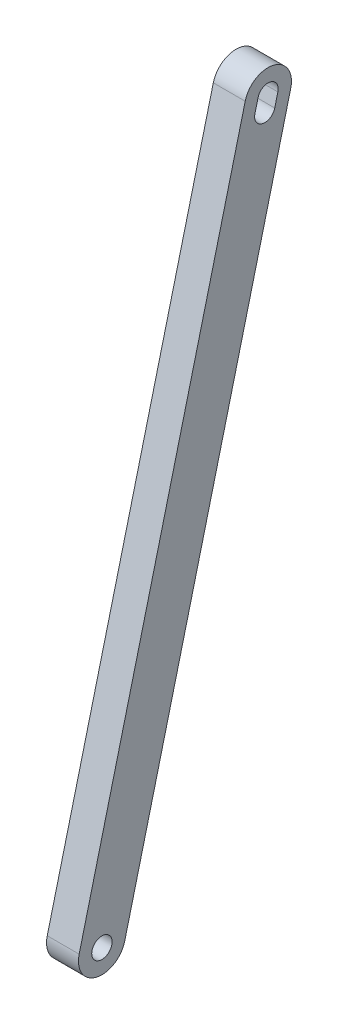
ISO-10303-21;
HEADER;
FILE_DESCRIPTION(('STEP AP214'),'2;1');
FILE_NAME('part.step','',(''),(''),'','','');
FILE_SCHEMA(('AUTOMOTIVE_DESIGN { 1 0 10303 214 1 1 1 1 }'));
ENDSEC;
DATA;
#1=APPLICATION_CONTEXT('core data for automotive mechanical design processes');
#2=APPLICATION_PROTOCOL_DEFINITION('international standard','automotive_design',2000,#1);
#3=PRODUCT_CONTEXT('',#1,'mechanical');
#4=PRODUCT('Part','Part','',(#3));
#5=PRODUCT_RELATED_PRODUCT_CATEGORY('part','',(#4));
#6=PRODUCT_DEFINITION_FORMATION('','',#4);
#7=PRODUCT_DEFINITION_CONTEXT('part definition',#1,'design');
#8=PRODUCT_DEFINITION('design','',#6,#7);
#9=PRODUCT_DEFINITION_SHAPE('','',#8);
#10=(LENGTH_UNIT() NAMED_UNIT(*) SI_UNIT(.MILLI.,.METRE.));
#11=(NAMED_UNIT(*) PLANE_ANGLE_UNIT() SI_UNIT($,.RADIAN.));
#12=(NAMED_UNIT(*) SI_UNIT($,.STERADIAN.) SOLID_ANGLE_UNIT());
#13=UNCERTAINTY_MEASURE_WITH_UNIT(LENGTH_MEASURE(1.E-05),#10,'distance_accuracy_value','');
#14=(GEOMETRIC_REPRESENTATION_CONTEXT(3) GLOBAL_UNCERTAINTY_ASSIGNED_CONTEXT((#13)) GLOBAL_UNIT_ASSIGNED_CONTEXT((#10,
#11,#12)) REPRESENTATION_CONTEXT('',''));
#15=CARTESIAN_POINT('',(0.,0.,0.));
#16=DIRECTION('',(0.,0.,1.));
#17=DIRECTION('',(1.,0.,0.));
#18=AXIS2_PLACEMENT_3D('',#15,#16,#17);
#19=CARTESIAN_POINT('',(-24.,0.,38.66));
#20=DIRECTION('',(1.,0.,0.));
#21=DIRECTION('',(0.,0.,-1.));
#22=AXIS2_PLACEMENT_3D('',#19,#20,#21);
#23=CYLINDRICAL_SURFACE('',#22,3.68146636835648);
#24=CARTESIAN_POINT('',(-19.,0.,38.66));
#25=DIRECTION('',(-1.,0.,0.));
#26=DIRECTION('',(0.,0.,1.));
#27=AXIS2_PLACEMENT_3D('',#24,#25,#26);
#28=CIRCLE('',#27,3.68146636835648);
#29=CARTESIAN_POINT('',(-19.,0.903807820001601,42.2287989640555));
#30=VERTEX_POINT('',#29);
#31=CARTESIAN_POINT('',(-19.,-0.903807820001601,35.0912010359445));
#32=VERTEX_POINT('',#31);
#33=EDGE_CURVE('E139',#30,#32,#28,.T.);
#34=ORIENTED_EDGE('',*,*,#33,.T.);
#35=DIRECTION('',(1.,0.,0.));
#36=VECTOR('',#35,1.);
#37=CARTESIAN_POINT('',(-24.,-0.903807820001601,35.0912010359445));
#38=LINE('',#37,#36);
#39=CARTESIAN_POINT('',(-24.,-0.903807820001601,35.0912010359445));
#40=VERTEX_POINT('',#39);
#41=EDGE_CURVE('E11',#40,#32,#38,.T.);
#42=ORIENTED_EDGE('',*,*,#41,.F.);
#43=CARTESIAN_POINT('',(-24.,0.,38.66));
#44=DIRECTION('',(-1.,0.,0.));
#45=DIRECTION('',(0.,0.,1.));
#46=AXIS2_PLACEMENT_3D('',#43,#44,#45);
#47=CIRCLE('',#46,3.68146636835648);
#48=CARTESIAN_POINT('',(-24.,0.903807820001601,42.2287989640555));
#49=VERTEX_POINT('',#48);
#50=EDGE_CURVE('E177',#49,#40,#47,.T.);
#51=ORIENTED_EDGE('',*,*,#50,.F.);
#52=DIRECTION('',(1.,0.,0.));
#53=VECTOR('',#52,1.);
#54=CARTESIAN_POINT('',(-24.,0.903807820001601,42.2287989640555));
#55=LINE('',#54,#53);
#56=EDGE_CURVE('E68',#49,#30,#55,.T.);
#57=ORIENTED_EDGE('',*,*,#56,.T.);
#58=EDGE_LOOP('',(#34,#42,#51,#57));
#59=FACE_BOUND('',#58,.T.);
#60=ADVANCED_FACE('F42',(#59),#23,.T.);
#61=CARTESIAN_POINT('',(-24.,8.29683886746099,32.7611128160827));
#62=DIRECTION('',(0.,0.245502125938228,0.969396052271625));
#63=DIRECTION('',(0.,-0.969396052271625,0.245502125938228));
#64=AXIS2_PLACEMENT_3D('',#61,#62,#63);
#65=PLANE('',#64);
#66=DIRECTION('',(0.,-0.969396052271625,0.245502125938228));
#67=VECTOR('',#66,1.);
#68=CARTESIAN_POINT('',(-19.,8.29683886746099,32.7611128160827));
#69=LINE('',#68,#67);
#70=CARTESIAN_POINT('',(-19.,-103.659789360794,61.1144263853967));
#71=VERTEX_POINT('',#70);
#72=EDGE_CURVE('E141',#32,#71,#69,.T.);
#73=ORIENTED_EDGE('',*,*,#72,.T.);
#74=DIRECTION('',(1.,0.,0.));
#75=VECTOR('',#74,1.);
#76=CARTESIAN_POINT('',(-24.,-103.659789360794,61.1144263853967));
#77=LINE('',#76,#75);
#78=CARTESIAN_POINT('',(-24.,-103.659789360794,61.1144263853967));
#79=VERTEX_POINT('',#78);
#80=EDGE_CURVE('E55',#79,#71,#77,.T.);
#81=ORIENTED_EDGE('',*,*,#80,.F.);
#82=DIRECTION('',(0.,-0.969396052271625,0.245502125938228));
#83=VECTOR('',#82,1.);
#84=CARTESIAN_POINT('',(-24.,8.29683886746099,32.7611128160827));
#85=LINE('',#84,#83);
#86=EDGE_CURVE('E94',#40,#79,#85,.T.);
#87=ORIENTED_EDGE('',*,*,#86,.F.);
#88=ORIENTED_EDGE('',*,*,#41,.T.);
#89=EDGE_LOOP('',(#73,#81,#87,#88));
#90=FACE_BOUND('',#89,.T.);
#91=ADVANCED_FACE('F216',(#90),#65,.F.);
#92=CARTESIAN_POINT('',(-24.,-102.755981540792,64.6832253494522));
#93=DIRECTION('',(1.,0.,0.));
#94=DIRECTION('',(0.,0.,-1.));
#95=AXIS2_PLACEMENT_3D('',#92,#93,#94);
#96=CYLINDRICAL_SURFACE('',#95,3.68146636835646);
#97=CARTESIAN_POINT('',(-19.,-102.755981540792,64.6832253494522));
#98=DIRECTION('',(-1.,0.,0.));
#99=DIRECTION('',(0.,0.,1.));
#100=AXIS2_PLACEMENT_3D('',#97,#98,#99);
#101=CIRCLE('',#100,3.68146636835646);
#102=CARTESIAN_POINT('',(-19.,-101.852173720791,68.2520243135077));
#103=VERTEX_POINT('',#102);
#104=EDGE_CURVE('E155',#71,#103,#101,.T.);
#105=ORIENTED_EDGE('',*,*,#104,.T.);
#106=DIRECTION('',(1.,0.,0.));
#107=VECTOR('',#106,1.);
#108=CARTESIAN_POINT('',(-24.,-101.852173720791,68.2520243135077));
#109=LINE('',#108,#107);
#110=CARTESIAN_POINT('',(-24.,-101.852173720791,68.2520243135077));
#111=VERTEX_POINT('',#110);
#112=EDGE_CURVE('E165',#111,#103,#109,.T.);
#113=ORIENTED_EDGE('',*,*,#112,.F.);
#114=CARTESIAN_POINT('',(-24.,-102.755981540792,64.6832253494522));
#115=DIRECTION('',(-1.,0.,0.));
#116=DIRECTION('',(0.,0.,1.));
#117=AXIS2_PLACEMENT_3D('',#114,#115,#116);
#118=CIRCLE('',#117,3.68146636835646);
#119=EDGE_CURVE('E166',#79,#111,#118,.T.);
#120=ORIENTED_EDGE('',*,*,#119,.F.);
#121=ORIENTED_EDGE('',*,*,#80,.T.);
#122=EDGE_LOOP('',(#105,#113,#120,#121));
#123=FACE_BOUND('',#122,.T.);
#124=ADVANCED_FACE('F170',(#123),#96,.T.);
#125=CARTESIAN_POINT('',(-24.,10.1044545074642,39.8987107441938));
#126=DIRECTION('',(0.,0.245502125938228,0.969396052271625));
#127=DIRECTION('',(0.,-0.969396052271625,0.245502125938228));
#128=AXIS2_PLACEMENT_3D('',#125,#126,#127);
#129=PLANE('',#128);
#130=DIRECTION('',(0.,-0.969396052271625,0.245502125938228));
#131=VECTOR('',#130,1.);
#132=CARTESIAN_POINT('',(-19.,10.1044545074642,39.8987107441938));
#133=LINE('',#132,#131);
#134=EDGE_CURVE('E154',#30,#103,#133,.T.);
#135=ORIENTED_EDGE('',*,*,#134,.F.);
#136=ORIENTED_EDGE('',*,*,#56,.F.);
#137=DIRECTION('',(0.,-0.969396052271625,0.245502125938228));
#138=VECTOR('',#137,1.);
#139=CARTESIAN_POINT('',(-24.,10.1044545074642,39.8987107441938));
#140=LINE('',#139,#138);
#141=EDGE_CURVE('E175',#49,#111,#140,.T.);
#142=ORIENTED_EDGE('',*,*,#141,.T.);
#143=ORIENTED_EDGE('',*,*,#112,.T.);
#144=EDGE_LOOP('',(#135,#136,#142,#143));
#145=FACE_BOUND('',#144,.T.);
#146=ADVANCED_FACE('F174',(#145),#129,.T.);
#147=CARTESIAN_POINT('',(-24.,0.,38.66));
#148=DIRECTION('',(1.,0.,0.));
#149=DIRECTION('',(0.,0.,-1.));
#150=AXIS2_PLACEMENT_3D('',#147,#148,#149);
#151=CYLINDRICAL_SURFACE('',#150,1.6);
#152=CARTESIAN_POINT('',(-19.,0.,38.66));
#153=DIRECTION('',(-1.,0.,0.));
#154=DIRECTION('',(0.,0.,1.));
#155=AXIS2_PLACEMENT_3D('',#152,#153,#154);
#156=CIRCLE('',#155,1.6);
#157=CARTESIAN_POINT('',(-19.,-0.392803401501166,37.1089663163654));
#158=VERTEX_POINT('',#157);
#159=CARTESIAN_POINT('',(-19.,0.392803401501166,40.2110336836346));
#160=VERTEX_POINT('',#159);
#161=EDGE_CURVE('E133',#158,#160,#156,.F.);
#162=ORIENTED_EDGE('',*,*,#161,.T.);
#163=DIRECTION('',(-1.,0.,0.));
#164=VECTOR('',#163,1.);
#165=CARTESIAN_POINT('',(-19.,0.392803401501166,40.2110336836346));
#166=LINE('',#165,#164);
#167=CARTESIAN_POINT('',(-24.,0.392803401501166,40.2110336836346));
#168=VERTEX_POINT('',#167);
#169=EDGE_CURVE('E143',#160,#168,#166,.T.);
#170=ORIENTED_EDGE('',*,*,#169,.T.);
#171=CARTESIAN_POINT('',(-24.,0.,38.66));
#172=DIRECTION('',(-1.,0.,0.));
#173=DIRECTION('',(0.,0.,1.));
#174=AXIS2_PLACEMENT_3D('',#171,#172,#173);
#175=CIRCLE('',#174,1.6);
#176=CARTESIAN_POINT('',(-24.,-0.392803401501166,37.1089663163654));
#177=VERTEX_POINT('',#176);
#178=EDGE_CURVE('E136',#177,#168,#175,.F.);
#179=ORIENTED_EDGE('',*,*,#178,.F.);
#180=DIRECTION('',(-1.,0.,0.));
#181=VECTOR('',#180,1.);
#182=CARTESIAN_POINT('',(-19.,-0.392803401501166,37.1089663163654));
#183=LINE('',#182,#181);
#184=EDGE_CURVE('E117',#158,#177,#183,.T.);
#185=ORIENTED_EDGE('',*,*,#184,.F.);
#186=EDGE_LOOP('',(#162,#170,#179,#185));
#187=FACE_BOUND('',#186,.T.);
#188=ADVANCED_FACE('F46',(#187),#151,.F.);
#189=CARTESIAN_POINT('',(-24.,-102.755981540792,64.6832253494522));
#190=DIRECTION('',(1.,0.,0.));
#191=DIRECTION('',(0.,0.,-1.));
#192=AXIS2_PLACEMENT_3D('',#189,#190,#191);
#193=CYLINDRICAL_SURFACE('',#192,1.60000000000001);
#194=CARTESIAN_POINT('',(-24.,-102.755981540792,64.6832253494522));
#195=DIRECTION('',(-1.,0.,0.));
#196=DIRECTION('',(0.,0.,1.));
#197=AXIS2_PLACEMENT_3D('',#194,#195,#196);
#198=CIRCLE('',#197,1.60000000000001);
#199=CARTESIAN_POINT('',(-24.,-102.755981540792,66.2832253494522));
#200=VERTEX_POINT('',#199);
#201=EDGE_CURVE('E146',#200,#200,#198,.T.);
#202=ORIENTED_EDGE('',*,*,#201,.T.);
#203=EDGE_LOOP('',(#202));
#204=FACE_BOUND('',#203,.T.);
#205=CARTESIAN_POINT('',(-19.,-102.755981540792,64.6832253494522));
#206=DIRECTION('',(-1.,0.,0.));
#207=DIRECTION('',(0.,0.,1.));
#208=AXIS2_PLACEMENT_3D('',#205,#206,#207);
#209=CIRCLE('',#208,1.60000000000001);
#210=CARTESIAN_POINT('',(-19.,-102.755981540792,66.2832253494522));
#211=VERTEX_POINT('',#210);
#212=EDGE_CURVE('E158',#211,#211,#209,.T.);
#213=ORIENTED_EDGE('',*,*,#212,.F.);
#214=EDGE_LOOP('',(#213));
#215=FACE_BOUND('',#214,.T.);
#216=ADVANCED_FACE('F200',(#204,#215),#193,.F.);
#217=CARTESIAN_POINT('',(-24.,0.,0.));
#218=DIRECTION('',(-1.,0.,0.));
#219=DIRECTION('',(0.,0.,1.));
#220=AXIS2_PLACEMENT_3D('',#217,#218,#219);
#221=PLANE('',#220);
#222=DIRECTION('',(0.,-0.969396052271623,0.245502125938234));
#223=VECTOR('',#222,1.);
#224=CARTESIAN_POINT('',(-24.,-0.392803401501166,37.1089663163654));
#225=LINE('',#224,#223);
#226=CARTESIAN_POINT('',(-24.,-2.33159550604441,37.5999705682419));
#227=VERTEX_POINT('',#226);
#228=EDGE_CURVE('E190',#177,#227,#225,.T.);
#229=ORIENTED_EDGE('',*,*,#228,.F.);
#230=ORIENTED_EDGE('',*,*,#178,.T.);
#231=DIRECTION('',(0.,0.969396052271626,-0.245502125938224));
#232=VECTOR('',#231,1.);
#233=CARTESIAN_POINT('',(-24.,0.392803401501166,40.2110336836346));
#234=LINE('',#233,#232);
#235=CARTESIAN_POINT('',(-24.,-1.54598870304208,40.702037935511));
#236=VERTEX_POINT('',#235);
#237=EDGE_CURVE('E126',#236,#168,#234,.T.);
#238=ORIENTED_EDGE('',*,*,#237,.F.);
#239=CARTESIAN_POINT('',(-24.,-1.93879210454324,39.1510042518765));
#240=DIRECTION('',(-1.,0.,0.));
#241=DIRECTION('',(0.,0.,1.));
#242=AXIS2_PLACEMENT_3D('',#239,#240,#241);
#243=CIRCLE('',#242,1.59999999999999);
#244=EDGE_CURVE('E183',#227,#236,#243,.T.);
#245=ORIENTED_EDGE('',*,*,#244,.F.);
#246=EDGE_LOOP('',(#229,#230,#238,#245));
#247=FACE_BOUND('',#246,.T.);
#248=ORIENTED_EDGE('',*,*,#50,.T.);
#249=ORIENTED_EDGE('',*,*,#86,.T.);
#250=ORIENTED_EDGE('',*,*,#119,.T.);
#251=ORIENTED_EDGE('',*,*,#141,.F.);
#252=EDGE_LOOP('',(#248,#249,#250,#251));
#253=FACE_BOUND('',#252,.T.);
#254=ORIENTED_EDGE('',*,*,#201,.F.);
#255=EDGE_LOOP('',(#254));
#256=FACE_BOUND('',#255,.T.);
#257=ADVANCED_FACE('F197',(#247,#253,#256),#221,.T.);
#258=CARTESIAN_POINT('',(-19.,0.,0.));
#259=DIRECTION('',(-1.,0.,0.));
#260=DIRECTION('',(0.,0.,1.));
#261=AXIS2_PLACEMENT_3D('',#258,#259,#260);
#262=PLANE('',#261);
#263=CARTESIAN_POINT('',(-19.,-1.93879210454324,39.1510042518765));
#264=DIRECTION('',(-1.,0.,0.));
#265=DIRECTION('',(0.,0.,1.));
#266=AXIS2_PLACEMENT_3D('',#263,#264,#265);
#267=CIRCLE('',#266,1.59999999999999);
#268=CARTESIAN_POINT('',(-19.,-2.33159550604441,37.5999705682419));
#269=VERTEX_POINT('',#268);
#270=CARTESIAN_POINT('',(-19.,-1.54598870304208,40.702037935511));
#271=VERTEX_POINT('',#270);
#272=EDGE_CURVE('E130',#269,#271,#267,.T.);
#273=ORIENTED_EDGE('',*,*,#272,.T.);
#274=DIRECTION('',(0.,0.969396052271626,-0.245502125938224));
#275=VECTOR('',#274,1.);
#276=CARTESIAN_POINT('',(-19.,0.392803401501166,40.2110336836346));
#277=LINE('',#276,#275);
#278=EDGE_CURVE('E56',#271,#160,#277,.T.);
#279=ORIENTED_EDGE('',*,*,#278,.T.);
#280=ORIENTED_EDGE('',*,*,#161,.F.);
#281=DIRECTION('',(0.,-0.969396052271623,0.245502125938234));
#282=VECTOR('',#281,1.);
#283=CARTESIAN_POINT('',(-19.,-0.392803401501166,37.1089663163654));
#284=LINE('',#283,#282);
#285=EDGE_CURVE('E119',#158,#269,#284,.T.);
#286=ORIENTED_EDGE('',*,*,#285,.T.);
#287=EDGE_LOOP('',(#273,#279,#280,#286));
#288=FACE_BOUND('',#287,.T.);
#289=ORIENTED_EDGE('',*,*,#33,.F.);
#290=ORIENTED_EDGE('',*,*,#134,.T.);
#291=ORIENTED_EDGE('',*,*,#104,.F.);
#292=ORIENTED_EDGE('',*,*,#72,.F.);
#293=EDGE_LOOP('',(#289,#290,#291,#292));
#294=FACE_BOUND('',#293,.T.);
#295=ORIENTED_EDGE('',*,*,#212,.T.);
#296=EDGE_LOOP('',(#295));
#297=FACE_BOUND('',#296,.T.);
#298=ADVANCED_FACE('F138',(#288,#294,#297),#262,.F.);
#299=CARTESIAN_POINT('',(-19.,0.392803401501166,40.2110336836346));
#300=DIRECTION('',(0.,0.245502125938224,0.969396052271626));
#301=DIRECTION('',(0.,-0.969396052271626,0.245502125938224));
#302=AXIS2_PLACEMENT_3D('',#299,#300,#301);
#303=PLANE('',#302);
#304=ORIENTED_EDGE('',*,*,#237,.T.);
#305=ORIENTED_EDGE('',*,*,#169,.F.);
#306=ORIENTED_EDGE('',*,*,#278,.F.);
#307=DIRECTION('',(-1.,0.,0.));
#308=VECTOR('',#307,1.);
#309=CARTESIAN_POINT('',(-19.,-1.54598870304208,40.702037935511));
#310=LINE('',#309,#308);
#311=EDGE_CURVE('E144',#271,#236,#310,.T.);
#312=ORIENTED_EDGE('',*,*,#311,.T.);
#313=EDGE_LOOP('',(#304,#305,#306,#312));
#314=FACE_BOUND('',#313,.T.);
#315=ADVANCED_FACE('F194',(#314),#303,.F.);
#316=CARTESIAN_POINT('',(-19.,-1.93879210454324,39.1510042518765));
#317=DIRECTION('',(-1.,0.,0.));
#318=DIRECTION('',(0.,0.,1.));
#319=AXIS2_PLACEMENT_3D('',#316,#317,#318);
#320=CYLINDRICAL_SURFACE('',#319,1.59999999999999);
#321=ORIENTED_EDGE('',*,*,#244,.T.);
#322=ORIENTED_EDGE('',*,*,#311,.F.);
#323=ORIENTED_EDGE('',*,*,#272,.F.);
#324=DIRECTION('',(-1.,0.,0.));
#325=VECTOR('',#324,1.);
#326=CARTESIAN_POINT('',(-19.,-2.33159550604441,37.5999705682419));
#327=LINE('',#326,#325);
#328=EDGE_CURVE('E125',#269,#227,#327,.T.);
#329=ORIENTED_EDGE('',*,*,#328,.T.);
#330=EDGE_LOOP('',(#321,#322,#323,#329));
#331=FACE_BOUND('',#330,.T.);
#332=ADVANCED_FACE('F195',(#331),#320,.F.);
#333=CARTESIAN_POINT('',(-19.,-0.392803401501166,37.1089663163654));
#334=DIRECTION('',(0.,-0.245502125938234,-0.969396052271623));
#335=DIRECTION('',(0.,0.969396052271623,-0.245502125938234));
#336=AXIS2_PLACEMENT_3D('',#333,#334,#335);
#337=PLANE('',#336);
#338=ORIENTED_EDGE('',*,*,#228,.T.);
#339=ORIENTED_EDGE('',*,*,#328,.F.);
#340=ORIENTED_EDGE('',*,*,#285,.F.);
#341=ORIENTED_EDGE('',*,*,#184,.T.);
#342=EDGE_LOOP('',(#338,#339,#340,#341));
#343=FACE_BOUND('',#342,.T.);
#344=ADVANCED_FACE('F118',(#343),#337,.F.);
#345=CLOSED_SHELL('',(#60,#91,#124,#146,#188,#216,#257,#298,#315,#332,#344));
#346=MANIFOLD_SOLID_BREP('B2',#345);
#347=ADVANCED_BREP_SHAPE_REPRESENTATION('',(#18,#346),#14);
#348=SHAPE_DEFINITION_REPRESENTATION(#9,#347);
ENDSEC;
END-ISO-10303-21;
